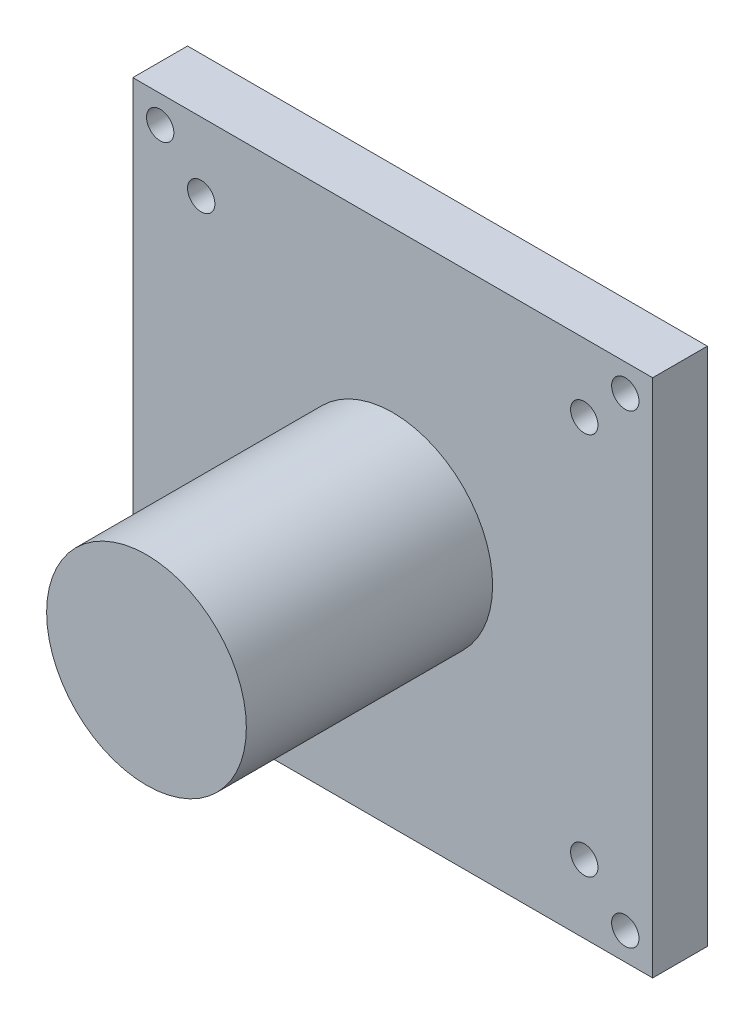
ISO-10303-21;
HEADER;
FILE_DESCRIPTION(('STEP AP214'),'2;1');
FILE_NAME('part.step','',(''),(''),'','','');
FILE_SCHEMA(('AUTOMOTIVE_DESIGN { 1 0 10303 214 1 1 1 1 }'));
ENDSEC;
DATA;
#1=APPLICATION_CONTEXT('core data for automotive mechanical design processes');
#2=APPLICATION_PROTOCOL_DEFINITION('international standard','automotive_design',2000,#1);
#3=PRODUCT_CONTEXT('',#1,'mechanical');
#4=PRODUCT('Part','Part','',(#3));
#5=PRODUCT_RELATED_PRODUCT_CATEGORY('part','',(#4));
#6=PRODUCT_DEFINITION_FORMATION('','',#4);
#7=PRODUCT_DEFINITION_CONTEXT('part definition',#1,'design');
#8=PRODUCT_DEFINITION('design','',#6,#7);
#9=PRODUCT_DEFINITION_SHAPE('','',#8);
#10=(LENGTH_UNIT() NAMED_UNIT(*) SI_UNIT(.MILLI.,.METRE.));
#11=(NAMED_UNIT(*) PLANE_ANGLE_UNIT() SI_UNIT($,.RADIAN.));
#12=(NAMED_UNIT(*) SI_UNIT($,.STERADIAN.) SOLID_ANGLE_UNIT());
#13=UNCERTAINTY_MEASURE_WITH_UNIT(LENGTH_MEASURE(1.E-05),#10,'distance_accuracy_value','');
#14=(GEOMETRIC_REPRESENTATION_CONTEXT(3) GLOBAL_UNCERTAINTY_ASSIGNED_CONTEXT((#13)) GLOBAL_UNIT_ASSIGNED_CONTEXT((#10,
#11,#12)) REPRESENTATION_CONTEXT('',''));
#15=CARTESIAN_POINT('',(0.,0.,0.));
#16=DIRECTION('',(0.,0.,1.));
#17=DIRECTION('',(1.,0.,0.));
#18=AXIS2_PLACEMENT_3D('',#15,#16,#17);
#19=CARTESIAN_POINT('',(0.,0.,4.));
#20=DIRECTION('',(0.,0.,-1.));
#21=DIRECTION('',(-1.,0.,0.));
#22=AXIS2_PLACEMENT_3D('',#19,#20,#21);
#23=PLANE('',#22);
#24=CARTESIAN_POINT('',(0.,0.,4.));
#25=DIRECTION('',(0.,0.,-1.));
#26=DIRECTION('',(-1.,0.,0.));
#27=AXIS2_PLACEMENT_3D('',#24,#25,#26);
#28=CIRCLE('',#27,7.3);
#29=CARTESIAN_POINT('',(-7.3,0.,4.));
#30=VERTEX_POINT('',#29);
#31=EDGE_CURVE('E160',#30,#30,#28,.T.);
#32=ORIENTED_EDGE('',*,*,#31,.T.);
#33=EDGE_LOOP('',(#32));
#34=FACE_BOUND('',#33,.T.);
#35=DIRECTION('',(0.,1.,0.));
#36=VECTOR('',#35,1.);
#37=CARTESIAN_POINT('',(19.,-19.,4.));
#38=LINE('',#37,#36);
#39=CARTESIAN_POINT('',(19.,-19.,4.));
#40=VERTEX_POINT('',#39);
#41=CARTESIAN_POINT('',(19.,19.,4.));
#42=VERTEX_POINT('',#41);
#43=EDGE_CURVE('E85',#40,#42,#38,.T.);
#44=ORIENTED_EDGE('',*,*,#43,.T.);
#45=DIRECTION('',(-1.,0.,0.));
#46=VECTOR('',#45,1.);
#47=CARTESIAN_POINT('',(-19.,19.,4.));
#48=LINE('',#47,#46);
#49=CARTESIAN_POINT('',(-19.,19.,4.));
#50=VERTEX_POINT('',#49);
#51=EDGE_CURVE('E80',#42,#50,#48,.T.);
#52=ORIENTED_EDGE('',*,*,#51,.T.);
#53=DIRECTION('',(0.,-1.,0.));
#54=VECTOR('',#53,1.);
#55=CARTESIAN_POINT('',(-19.,-19.,4.));
#56=LINE('',#55,#54);
#57=CARTESIAN_POINT('',(-19.,-19.,4.));
#58=VERTEX_POINT('',#57);
#59=EDGE_CURVE('E83',#50,#58,#56,.T.);
#60=ORIENTED_EDGE('',*,*,#59,.T.);
#61=DIRECTION('',(1.,0.,0.));
#62=VECTOR('',#61,1.);
#63=CARTESIAN_POINT('',(-19.,-19.,4.));
#64=LINE('',#63,#62);
#65=EDGE_CURVE('E50',#58,#40,#64,.T.);
#66=ORIENTED_EDGE('',*,*,#65,.T.);
#67=EDGE_LOOP('',(#44,#52,#60,#66));
#68=FACE_BOUND('',#67,.T.);
#69=CARTESIAN_POINT('',(14.,14.,4.));
#70=DIRECTION('',(0.,0.,1.));
#71=DIRECTION('',(1.,0.,0.));
#72=AXIS2_PLACEMENT_3D('',#69,#70,#71);
#73=CIRCLE('',#72,0.999999999999999);
#74=CARTESIAN_POINT('',(15.,14.,4.));
#75=VERTEX_POINT('',#74);
#76=EDGE_CURVE('E100',#75,#75,#73,.T.);
#77=ORIENTED_EDGE('',*,*,#76,.F.);
#78=EDGE_LOOP('',(#77));
#79=FACE_BOUND('',#78,.T.);
#80=CARTESIAN_POINT('',(17.,17.,4.));
#81=DIRECTION('',(0.,0.,1.));
#82=DIRECTION('',(1.,0.,0.));
#83=AXIS2_PLACEMENT_3D('',#80,#81,#82);
#84=CIRCLE('',#83,1.);
#85=CARTESIAN_POINT('',(18.,17.,4.));
#86=VERTEX_POINT('',#85);
#87=EDGE_CURVE('E115',#86,#86,#84,.T.);
#88=ORIENTED_EDGE('',*,*,#87,.F.);
#89=EDGE_LOOP('',(#88));
#90=FACE_BOUND('',#89,.T.);
#91=CARTESIAN_POINT('',(14.,-14.,4.));
#92=DIRECTION('',(0.,0.,1.));
#93=DIRECTION('',(-1.,0.,0.));
#94=AXIS2_PLACEMENT_3D('',#91,#92,#93);
#95=CIRCLE('',#94,0.999999999999999);
#96=CARTESIAN_POINT('',(13.,-14.,4.));
#97=VERTEX_POINT('',#96);
#98=EDGE_CURVE('E121',#97,#97,#95,.T.);
#99=ORIENTED_EDGE('',*,*,#98,.F.);
#100=EDGE_LOOP('',(#99));
#101=FACE_BOUND('',#100,.T.);
#102=CARTESIAN_POINT('',(17.,-17.,4.));
#103=DIRECTION('',(0.,0.,1.));
#104=DIRECTION('',(-1.,0.,0.));
#105=AXIS2_PLACEMENT_3D('',#102,#103,#104);
#106=CIRCLE('',#105,1.);
#107=CARTESIAN_POINT('',(16.,-17.,4.));
#108=VERTEX_POINT('',#107);
#109=EDGE_CURVE('E127',#108,#108,#106,.T.);
#110=ORIENTED_EDGE('',*,*,#109,.F.);
#111=EDGE_LOOP('',(#110));
#112=FACE_BOUND('',#111,.T.);
#113=CARTESIAN_POINT('',(-14.,-14.,4.));
#114=DIRECTION('',(0.,0.,1.));
#115=DIRECTION('',(1.,0.,0.));
#116=AXIS2_PLACEMENT_3D('',#113,#114,#115);
#117=CIRCLE('',#116,0.999999999999999);
#118=CARTESIAN_POINT('',(-13.,-14.,4.));
#119=VERTEX_POINT('',#118);
#120=EDGE_CURVE('E133',#119,#119,#117,.T.);
#121=ORIENTED_EDGE('',*,*,#120,.F.);
#122=EDGE_LOOP('',(#121));
#123=FACE_BOUND('',#122,.T.);
#124=CARTESIAN_POINT('',(-17.,-17.,4.));
#125=DIRECTION('',(0.,0.,1.));
#126=DIRECTION('',(1.,0.,0.));
#127=AXIS2_PLACEMENT_3D('',#124,#125,#126);
#128=CIRCLE('',#127,1.);
#129=CARTESIAN_POINT('',(-16.,-17.,4.));
#130=VERTEX_POINT('',#129);
#131=EDGE_CURVE('E139',#130,#130,#128,.T.);
#132=ORIENTED_EDGE('',*,*,#131,.F.);
#133=EDGE_LOOP('',(#132));
#134=FACE_BOUND('',#133,.T.);
#135=CARTESIAN_POINT('',(-17.,17.,4.));
#136=DIRECTION('',(0.,0.,1.));
#137=DIRECTION('',(-1.,0.,0.));
#138=AXIS2_PLACEMENT_3D('',#135,#136,#137);
#139=CIRCLE('',#138,1.);
#140=CARTESIAN_POINT('',(-18.,17.,4.));
#141=VERTEX_POINT('',#140);
#142=EDGE_CURVE('E145',#141,#141,#139,.T.);
#143=ORIENTED_EDGE('',*,*,#142,.F.);
#144=EDGE_LOOP('',(#143));
#145=FACE_BOUND('',#144,.T.);
#146=CARTESIAN_POINT('',(-14.,14.,4.));
#147=DIRECTION('',(0.,0.,1.));
#148=DIRECTION('',(-1.,0.,0.));
#149=AXIS2_PLACEMENT_3D('',#146,#147,#148);
#150=CIRCLE('',#149,0.999999999999999);
#151=CARTESIAN_POINT('',(-15.,14.,4.));
#152=VERTEX_POINT('',#151);
#153=EDGE_CURVE('E151',#152,#152,#150,.T.);
#154=ORIENTED_EDGE('',*,*,#153,.F.);
#155=EDGE_LOOP('',(#154));
#156=FACE_BOUND('',#155,.T.);
#157=ADVANCED_FACE('F33',(#34,#68,#79,#90,#101,#112,#123,#134,#145,#156),#23,.F.);
#158=CARTESIAN_POINT('',(0.,0.,0.));
#159=DIRECTION('',(0.,0.,-1.));
#160=DIRECTION('',(-1.,0.,0.));
#161=AXIS2_PLACEMENT_3D('',#158,#159,#160);
#162=PLANE('',#161);
#163=CARTESIAN_POINT('',(-17.,17.,0.));
#164=DIRECTION('',(0.,0.,1.));
#165=DIRECTION('',(-1.,0.,0.));
#166=AXIS2_PLACEMENT_3D('',#163,#164,#165);
#167=CIRCLE('',#166,1.);
#168=CARTESIAN_POINT('',(-18.,17.,0.));
#169=VERTEX_POINT('',#168);
#170=EDGE_CURVE('E148',#169,#169,#167,.T.);
#171=ORIENTED_EDGE('',*,*,#170,.T.);
#172=EDGE_LOOP('',(#171));
#173=FACE_BOUND('',#172,.T.);
#174=CARTESIAN_POINT('',(-14.,-14.,0.));
#175=DIRECTION('',(0.,0.,1.));
#176=DIRECTION('',(1.,0.,0.));
#177=AXIS2_PLACEMENT_3D('',#174,#175,#176);
#178=CIRCLE('',#177,0.999999999999999);
#179=CARTESIAN_POINT('',(-13.,-14.,0.));
#180=VERTEX_POINT('',#179);
#181=EDGE_CURVE('E136',#180,#180,#178,.T.);
#182=ORIENTED_EDGE('',*,*,#181,.T.);
#183=EDGE_LOOP('',(#182));
#184=FACE_BOUND('',#183,.T.);
#185=CARTESIAN_POINT('',(14.,-14.,0.));
#186=DIRECTION('',(0.,0.,1.));
#187=DIRECTION('',(-1.,0.,0.));
#188=AXIS2_PLACEMENT_3D('',#185,#186,#187);
#189=CIRCLE('',#188,0.999999999999999);
#190=CARTESIAN_POINT('',(13.,-14.,0.));
#191=VERTEX_POINT('',#190);
#192=EDGE_CURVE('E124',#191,#191,#189,.T.);
#193=ORIENTED_EDGE('',*,*,#192,.T.);
#194=EDGE_LOOP('',(#193));
#195=FACE_BOUND('',#194,.T.);
#196=CARTESIAN_POINT('',(14.,14.,0.));
#197=DIRECTION('',(0.,0.,1.));
#198=DIRECTION('',(1.,0.,0.));
#199=AXIS2_PLACEMENT_3D('',#196,#197,#198);
#200=CIRCLE('',#199,0.999999999999999);
#201=CARTESIAN_POINT('',(15.,14.,0.));
#202=VERTEX_POINT('',#201);
#203=EDGE_CURVE('E112',#202,#202,#200,.T.);
#204=ORIENTED_EDGE('',*,*,#203,.T.);
#205=EDGE_LOOP('',(#204));
#206=FACE_BOUND('',#205,.T.);
#207=DIRECTION('',(0.,1.,0.));
#208=VECTOR('',#207,1.);
#209=CARTESIAN_POINT('',(19.,-19.,0.));
#210=LINE('',#209,#208);
#211=CARTESIAN_POINT('',(19.,-19.,0.));
#212=VERTEX_POINT('',#211);
#213=CARTESIAN_POINT('',(19.,19.,0.));
#214=VERTEX_POINT('',#213);
#215=EDGE_CURVE('E97',#212,#214,#210,.T.);
#216=ORIENTED_EDGE('',*,*,#215,.F.);
#217=DIRECTION('',(1.,0.,0.));
#218=VECTOR('',#217,1.);
#219=CARTESIAN_POINT('',(-19.,-19.,0.));
#220=LINE('',#219,#218);
#221=CARTESIAN_POINT('',(-19.,-19.,0.));
#222=VERTEX_POINT('',#221);
#223=EDGE_CURVE('E73',#222,#212,#220,.T.);
#224=ORIENTED_EDGE('',*,*,#223,.F.);
#225=DIRECTION('',(0.,-1.,0.));
#226=VECTOR('',#225,1.);
#227=CARTESIAN_POINT('',(-19.,-19.,0.));
#228=LINE('',#227,#226);
#229=CARTESIAN_POINT('',(-19.,19.,0.));
#230=VERTEX_POINT('',#229);
#231=EDGE_CURVE('E67',#230,#222,#228,.T.);
#232=ORIENTED_EDGE('',*,*,#231,.F.);
#233=DIRECTION('',(-1.,0.,0.));
#234=VECTOR('',#233,1.);
#235=CARTESIAN_POINT('',(-19.,19.,0.));
#236=LINE('',#235,#234);
#237=EDGE_CURVE('E89',#214,#230,#236,.T.);
#238=ORIENTED_EDGE('',*,*,#237,.F.);
#239=EDGE_LOOP('',(#216,#224,#232,#238));
#240=FACE_BOUND('',#239,.T.);
#241=CARTESIAN_POINT('',(17.,17.,0.));
#242=DIRECTION('',(0.,0.,1.));
#243=DIRECTION('',(1.,0.,0.));
#244=AXIS2_PLACEMENT_3D('',#241,#242,#243);
#245=CIRCLE('',#244,1.);
#246=CARTESIAN_POINT('',(18.,17.,0.));
#247=VERTEX_POINT('',#246);
#248=EDGE_CURVE('E118',#247,#247,#245,.T.);
#249=ORIENTED_EDGE('',*,*,#248,.T.);
#250=EDGE_LOOP('',(#249));
#251=FACE_BOUND('',#250,.T.);
#252=CARTESIAN_POINT('',(17.,-17.,0.));
#253=DIRECTION('',(0.,0.,1.));
#254=DIRECTION('',(-1.,0.,0.));
#255=AXIS2_PLACEMENT_3D('',#252,#253,#254);
#256=CIRCLE('',#255,1.);
#257=CARTESIAN_POINT('',(16.,-17.,0.));
#258=VERTEX_POINT('',#257);
#259=EDGE_CURVE('E130',#258,#258,#256,.T.);
#260=ORIENTED_EDGE('',*,*,#259,.T.);
#261=EDGE_LOOP('',(#260));
#262=FACE_BOUND('',#261,.T.);
#263=CARTESIAN_POINT('',(-17.,-17.,0.));
#264=DIRECTION('',(0.,0.,1.));
#265=DIRECTION('',(1.,0.,0.));
#266=AXIS2_PLACEMENT_3D('',#263,#264,#265);
#267=CIRCLE('',#266,1.);
#268=CARTESIAN_POINT('',(-16.,-17.,0.));
#269=VERTEX_POINT('',#268);
#270=EDGE_CURVE('E142',#269,#269,#267,.T.);
#271=ORIENTED_EDGE('',*,*,#270,.T.);
#272=EDGE_LOOP('',(#271));
#273=FACE_BOUND('',#272,.T.);
#274=CARTESIAN_POINT('',(-14.,14.,0.));
#275=DIRECTION('',(0.,0.,1.));
#276=DIRECTION('',(-1.,0.,0.));
#277=AXIS2_PLACEMENT_3D('',#274,#275,#276);
#278=CIRCLE('',#277,0.999999999999999);
#279=CARTESIAN_POINT('',(-15.,14.,0.));
#280=VERTEX_POINT('',#279);
#281=EDGE_CURVE('E154',#280,#280,#278,.T.);
#282=ORIENTED_EDGE('',*,*,#281,.T.);
#283=EDGE_LOOP('',(#282));
#284=FACE_BOUND('',#283,.T.);
#285=ADVANCED_FACE('F108',(#173,#184,#195,#206,#240,#251,#262,#273,#284),#162,.T.);
#286=CARTESIAN_POINT('',(19.,-19.,4.));
#287=DIRECTION('',(-1.,0.,0.));
#288=DIRECTION('',(0.,0.,1.));
#289=AXIS2_PLACEMENT_3D('',#286,#287,#288);
#290=PLANE('',#289);
#291=ORIENTED_EDGE('',*,*,#215,.T.);
#292=DIRECTION('',(0.,0.,-1.));
#293=VECTOR('',#292,1.);
#294=CARTESIAN_POINT('',(19.,19.,4.));
#295=LINE('',#294,#293);
#296=EDGE_CURVE('E11',#42,#214,#295,.T.);
#297=ORIENTED_EDGE('',*,*,#296,.F.);
#298=ORIENTED_EDGE('',*,*,#43,.F.);
#299=DIRECTION('',(0.,0.,-1.));
#300=VECTOR('',#299,1.);
#301=CARTESIAN_POINT('',(19.,-19.,4.));
#302=LINE('',#301,#300);
#303=EDGE_CURVE('E93',#40,#212,#302,.T.);
#304=ORIENTED_EDGE('',*,*,#303,.T.);
#305=EDGE_LOOP('',(#291,#297,#298,#304));
#306=FACE_BOUND('',#305,.T.);
#307=ADVANCED_FACE('F35',(#306),#290,.F.);
#308=CARTESIAN_POINT('',(-19.,19.,4.));
#309=DIRECTION('',(0.,-1.,0.));
#310=DIRECTION('',(0.,0.,-1.));
#311=AXIS2_PLACEMENT_3D('',#308,#309,#310);
#312=PLANE('',#311);
#313=ORIENTED_EDGE('',*,*,#237,.T.);
#314=DIRECTION('',(0.,0.,-1.));
#315=VECTOR('',#314,1.);
#316=CARTESIAN_POINT('',(-19.,19.,4.));
#317=LINE('',#316,#315);
#318=EDGE_CURVE('E42',#50,#230,#317,.T.);
#319=ORIENTED_EDGE('',*,*,#318,.F.);
#320=ORIENTED_EDGE('',*,*,#51,.F.);
#321=ORIENTED_EDGE('',*,*,#296,.T.);
#322=EDGE_LOOP('',(#313,#319,#320,#321));
#323=FACE_BOUND('',#322,.T.);
#324=ADVANCED_FACE('F88',(#323),#312,.F.);
#325=CARTESIAN_POINT('',(-19.,-19.,4.));
#326=DIRECTION('',(1.,0.,0.));
#327=DIRECTION('',(0.,0.,-1.));
#328=AXIS2_PLACEMENT_3D('',#325,#326,#327);
#329=PLANE('',#328);
#330=ORIENTED_EDGE('',*,*,#231,.T.);
#331=DIRECTION('',(0.,0.,-1.));
#332=VECTOR('',#331,1.);
#333=CARTESIAN_POINT('',(-19.,-19.,4.));
#334=LINE('',#333,#332);
#335=EDGE_CURVE('E90',#58,#222,#334,.T.);
#336=ORIENTED_EDGE('',*,*,#335,.F.);
#337=ORIENTED_EDGE('',*,*,#59,.F.);
#338=ORIENTED_EDGE('',*,*,#318,.T.);
#339=EDGE_LOOP('',(#330,#336,#337,#338));
#340=FACE_BOUND('',#339,.T.);
#341=ADVANCED_FACE('F91',(#340),#329,.F.);
#342=CARTESIAN_POINT('',(-19.,-19.,4.));
#343=DIRECTION('',(0.,1.,0.));
#344=DIRECTION('',(0.,0.,1.));
#345=AXIS2_PLACEMENT_3D('',#342,#343,#344);
#346=PLANE('',#345);
#347=ORIENTED_EDGE('',*,*,#223,.T.);
#348=ORIENTED_EDGE('',*,*,#303,.F.);
#349=ORIENTED_EDGE('',*,*,#65,.F.);
#350=ORIENTED_EDGE('',*,*,#335,.T.);
#351=EDGE_LOOP('',(#347,#348,#349,#350));
#352=FACE_BOUND('',#351,.T.);
#353=ADVANCED_FACE('F105',(#352),#346,.F.);
#354=CARTESIAN_POINT('',(14.,14.,4.));
#355=DIRECTION('',(0.,0.,-1.));
#356=DIRECTION('',(-1.,0.,0.));
#357=AXIS2_PLACEMENT_3D('',#354,#355,#356);
#358=CYLINDRICAL_SURFACE('',#357,0.999999999999999);
#359=ORIENTED_EDGE('',*,*,#76,.T.);
#360=EDGE_LOOP('',(#359));
#361=FACE_BOUND('',#360,.T.);
#362=ORIENTED_EDGE('',*,*,#203,.F.);
#363=EDGE_LOOP('',(#362));
#364=FACE_BOUND('',#363,.T.);
#365=ADVANCED_FACE('F186',(#361,#364),#358,.F.);
#366=CARTESIAN_POINT('',(17.,17.,4.));
#367=DIRECTION('',(0.,0.,-1.));
#368=DIRECTION('',(-1.,0.,0.));
#369=AXIS2_PLACEMENT_3D('',#366,#367,#368);
#370=CYLINDRICAL_SURFACE('',#369,1.);
#371=ORIENTED_EDGE('',*,*,#87,.T.);
#372=EDGE_LOOP('',(#371));
#373=FACE_BOUND('',#372,.T.);
#374=ORIENTED_EDGE('',*,*,#248,.F.);
#375=EDGE_LOOP('',(#374));
#376=FACE_BOUND('',#375,.T.);
#377=ADVANCED_FACE('F231',(#373,#376),#370,.F.);
#378=CARTESIAN_POINT('',(14.,-14.,4.));
#379=DIRECTION('',(0.,0.,-1.));
#380=DIRECTION('',(-1.,0.,0.));
#381=AXIS2_PLACEMENT_3D('',#378,#379,#380);
#382=CYLINDRICAL_SURFACE('',#381,0.999999999999999);
#383=ORIENTED_EDGE('',*,*,#98,.T.);
#384=EDGE_LOOP('',(#383));
#385=FACE_BOUND('',#384,.T.);
#386=ORIENTED_EDGE('',*,*,#192,.F.);
#387=EDGE_LOOP('',(#386));
#388=FACE_BOUND('',#387,.T.);
#389=ADVANCED_FACE('F239',(#385,#388),#382,.F.);
#390=CARTESIAN_POINT('',(17.,-17.,4.));
#391=DIRECTION('',(0.,0.,-1.));
#392=DIRECTION('',(-1.,0.,0.));
#393=AXIS2_PLACEMENT_3D('',#390,#391,#392);
#394=CYLINDRICAL_SURFACE('',#393,1.);
#395=ORIENTED_EDGE('',*,*,#109,.T.);
#396=EDGE_LOOP('',(#395));
#397=FACE_BOUND('',#396,.T.);
#398=ORIENTED_EDGE('',*,*,#259,.F.);
#399=EDGE_LOOP('',(#398));
#400=FACE_BOUND('',#399,.T.);
#401=ADVANCED_FACE('F247',(#397,#400),#394,.F.);
#402=CARTESIAN_POINT('',(-14.,-14.,4.));
#403=DIRECTION('',(0.,0.,-1.));
#404=DIRECTION('',(-1.,0.,0.));
#405=AXIS2_PLACEMENT_3D('',#402,#403,#404);
#406=CYLINDRICAL_SURFACE('',#405,0.999999999999999);
#407=ORIENTED_EDGE('',*,*,#120,.T.);
#408=EDGE_LOOP('',(#407));
#409=FACE_BOUND('',#408,.T.);
#410=ORIENTED_EDGE('',*,*,#181,.F.);
#411=EDGE_LOOP('',(#410));
#412=FACE_BOUND('',#411,.T.);
#413=ADVANCED_FACE('F256',(#409,#412),#406,.F.);
#414=CARTESIAN_POINT('',(-17.,-17.,4.));
#415=DIRECTION('',(0.,0.,-1.));
#416=DIRECTION('',(-1.,0.,0.));
#417=AXIS2_PLACEMENT_3D('',#414,#415,#416);
#418=CYLINDRICAL_SURFACE('',#417,1.);
#419=ORIENTED_EDGE('',*,*,#131,.T.);
#420=EDGE_LOOP('',(#419));
#421=FACE_BOUND('',#420,.T.);
#422=ORIENTED_EDGE('',*,*,#270,.F.);
#423=EDGE_LOOP('',(#422));
#424=FACE_BOUND('',#423,.T.);
#425=ADVANCED_FACE('F265',(#421,#424),#418,.F.);
#426=CARTESIAN_POINT('',(-17.,17.,4.));
#427=DIRECTION('',(0.,0.,-1.));
#428=DIRECTION('',(-1.,0.,0.));
#429=AXIS2_PLACEMENT_3D('',#426,#427,#428);
#430=CYLINDRICAL_SURFACE('',#429,1.);
#431=ORIENTED_EDGE('',*,*,#142,.T.);
#432=EDGE_LOOP('',(#431));
#433=FACE_BOUND('',#432,.T.);
#434=ORIENTED_EDGE('',*,*,#170,.F.);
#435=EDGE_LOOP('',(#434));
#436=FACE_BOUND('',#435,.T.);
#437=ADVANCED_FACE('F274',(#433,#436),#430,.F.);
#438=CARTESIAN_POINT('',(-14.,14.,4.));
#439=DIRECTION('',(0.,0.,-1.));
#440=DIRECTION('',(-1.,0.,0.));
#441=AXIS2_PLACEMENT_3D('',#438,#439,#440);
#442=CYLINDRICAL_SURFACE('',#441,0.999999999999999);
#443=ORIENTED_EDGE('',*,*,#153,.T.);
#444=EDGE_LOOP('',(#443));
#445=FACE_BOUND('',#444,.T.);
#446=ORIENTED_EDGE('',*,*,#281,.F.);
#447=EDGE_LOOP('',(#446));
#448=FACE_BOUND('',#447,.T.);
#449=ADVANCED_FACE('F175',(#445,#448),#442,.F.);
#450=CARTESIAN_POINT('',(0.,0.,22.));
#451=DIRECTION('',(0.,0.,-1.));
#452=DIRECTION('',(-1.,0.,0.));
#453=AXIS2_PLACEMENT_3D('',#450,#451,#452);
#454=CYLINDRICAL_SURFACE('',#453,7.3);
#455=CARTESIAN_POINT('',(0.,0.,22.));
#456=DIRECTION('',(0.,0.,-1.));
#457=DIRECTION('',(-1.,0.,0.));
#458=AXIS2_PLACEMENT_3D('',#455,#456,#457);
#459=CIRCLE('',#458,7.3);
#460=CARTESIAN_POINT('',(-7.3,0.,22.));
#461=VERTEX_POINT('',#460);
#462=EDGE_CURVE('E157',#461,#461,#459,.T.);
#463=ORIENTED_EDGE('',*,*,#462,.T.);
#464=EDGE_LOOP('',(#463));
#465=FACE_BOUND('',#464,.T.);
#466=ORIENTED_EDGE('',*,*,#31,.F.);
#467=EDGE_LOOP('',(#466));
#468=FACE_BOUND('',#467,.T.);
#469=ADVANCED_FACE('F166',(#465,#468),#454,.T.);
#470=CARTESIAN_POINT('',(0.,0.,22.));
#471=DIRECTION('',(0.,0.,-1.));
#472=DIRECTION('',(-1.,0.,0.));
#473=AXIS2_PLACEMENT_3D('',#470,#471,#472);
#474=PLANE('',#473);
#475=ORIENTED_EDGE('',*,*,#462,.F.);
#476=EDGE_LOOP('',(#475));
#477=FACE_BOUND('',#476,.T.);
#478=ADVANCED_FACE('F169',(#477),#474,.F.);
#479=CLOSED_SHELL('',(#157,#285,#307,#324,#341,#353,#365,#377,#389,#401,#413,#425,#437,#449,
#469,#478));
#480=MANIFOLD_SOLID_BREP('B2',#479);
#481=ADVANCED_BREP_SHAPE_REPRESENTATION('',(#18,#480),#14);
#482=SHAPE_DEFINITION_REPRESENTATION(#9,#481);
ENDSEC;
END-ISO-10303-21;
